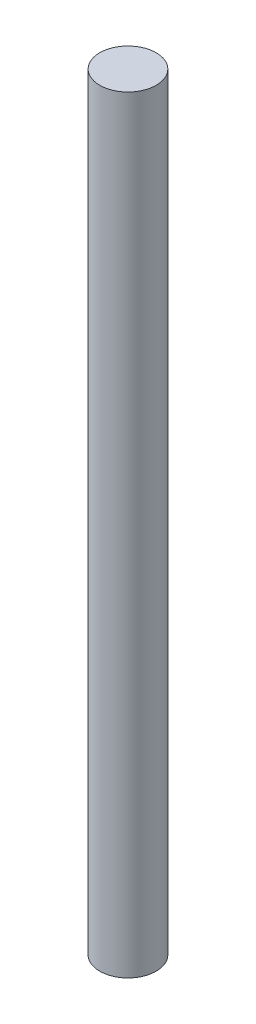
ISO-10303-21;
HEADER;
FILE_DESCRIPTION(('STEP AP214'),'2;1');
FILE_NAME('part.step','',(''),(''),'','','');
FILE_SCHEMA(('AUTOMOTIVE_DESIGN { 1 0 10303 214 1 1 1 1 }'));
ENDSEC;
DATA;
#1=APPLICATION_CONTEXT('core data for automotive mechanical design processes');
#2=APPLICATION_PROTOCOL_DEFINITION('international standard','automotive_design',2000,#1);
#3=PRODUCT_CONTEXT('',#1,'mechanical');
#4=PRODUCT('Part','Part','',(#3));
#5=PRODUCT_RELATED_PRODUCT_CATEGORY('part','',(#4));
#6=PRODUCT_DEFINITION_FORMATION('','',#4);
#7=PRODUCT_DEFINITION_CONTEXT('part definition',#1,'design');
#8=PRODUCT_DEFINITION('design','',#6,#7);
#9=PRODUCT_DEFINITION_SHAPE('','',#8);
#10=(LENGTH_UNIT() NAMED_UNIT(*) SI_UNIT(.MILLI.,.METRE.));
#11=(NAMED_UNIT(*) PLANE_ANGLE_UNIT() SI_UNIT($,.RADIAN.));
#12=(NAMED_UNIT(*) SI_UNIT($,.STERADIAN.) SOLID_ANGLE_UNIT());
#13=UNCERTAINTY_MEASURE_WITH_UNIT(LENGTH_MEASURE(1.E-05),#10,'distance_accuracy_value','');
#14=(GEOMETRIC_REPRESENTATION_CONTEXT(3) GLOBAL_UNCERTAINTY_ASSIGNED_CONTEXT((#13)) GLOBAL_UNIT_ASSIGNED_CONTEXT((#10,
#11,#12)) REPRESENTATION_CONTEXT('',''));
#15=CARTESIAN_POINT('',(0.,0.,0.));
#16=DIRECTION('',(0.,0.,1.));
#17=DIRECTION('',(1.,0.,0.));
#18=AXIS2_PLACEMENT_3D('',#15,#16,#17);
#19=CARTESIAN_POINT('',(7.49999999999998,204.,0.));
#20=DIRECTION('',(0.,-1.,0.));
#21=DIRECTION('',(1.,0.,0.));
#22=AXIS2_PLACEMENT_3D('',#19,#20,#21);
#23=PLANE('',#22);
#24=CARTESIAN_POINT('',(0.,204.,0.));
#25=DIRECTION('',(0.,1.,0.));
#26=DIRECTION('',(-1.,0.,0.));
#27=AXIS2_PLACEMENT_3D('',#24,#25,#26);
#28=CIRCLE('',#27,7.49999999999997);
#29=CARTESIAN_POINT('',(-7.49999999999997,204.,0.));
#30=VERTEX_POINT('',#29);
#31=EDGE_CURVE('E150',#30,#30,#28,.T.);
#32=ORIENTED_EDGE('',*,*,#31,.T.);
#33=EDGE_LOOP('',(#32));
#34=FACE_BOUND('',#33,.T.);
#35=ADVANCED_FACE('F32',(#34),#23,.F.);
#36=CARTESIAN_POINT('',(0.,204.,0.));
#37=DIRECTION('',(0.,1.,0.));
#38=DIRECTION('',(-1.,0.,0.));
#39=AXIS2_PLACEMENT_3D('',#36,#37,#38);
#40=CYLINDRICAL_SURFACE('',#39,7.49999999999998);
#41=DIRECTION('',(0.,1.,0.));
#42=VECTOR('',#41,1.);
#43=CARTESIAN_POINT('',(-1.49999999999999,204.,-7.34846922834952));
#44=LINE('',#43,#42);
#45=CARTESIAN_POINT('',(-1.5,89.,-7.34846922834952));
#46=VERTEX_POINT('',#45);
#47=CARTESIAN_POINT('',(-1.5,104.,-7.34846922834952));
#48=VERTEX_POINT('',#47);
#49=EDGE_CURVE('E39',#46,#48,#44,.T.);
#50=ORIENTED_EDGE('',*,*,#49,.F.);
#51=CARTESIAN_POINT('',(0.,89.,0.));
#52=DIRECTION('',(0.,-1.,0.));
#53=DIRECTION('',(0.,0.,-1.));
#54=AXIS2_PLACEMENT_3D('',#51,#52,#53);
#55=CIRCLE('',#54,7.49999999999998);
#56=CARTESIAN_POINT('',(1.5,89.,-7.34846922834952));
#57=VERTEX_POINT('',#56);
#58=EDGE_CURVE('E11',#46,#57,#55,.T.);
#59=ORIENTED_EDGE('',*,*,#58,.T.);
#60=DIRECTION('',(0.,1.,0.));
#61=VECTOR('',#60,1.);
#62=CARTESIAN_POINT('',(1.50000000000001,204.,-7.34846922834952));
#63=LINE('',#62,#61);
#64=CARTESIAN_POINT('',(1.5,104.,-7.34846922834952));
#65=VERTEX_POINT('',#64);
#66=EDGE_CURVE('E103',#65,#57,#63,.F.);
#67=ORIENTED_EDGE('',*,*,#66,.F.);
#68=CARTESIAN_POINT('',(0.,104.,0.));
#69=DIRECTION('',(0.,-1.,0.));
#70=DIRECTION('',(0.,0.,-1.));
#71=AXIS2_PLACEMENT_3D('',#68,#69,#70);
#72=CIRCLE('',#71,7.49999999999998);
#73=EDGE_CURVE('E164',#48,#65,#72,.T.);
#74=ORIENTED_EDGE('',*,*,#73,.F.);
#75=EDGE_LOOP('',(#50,#59,#67,#74));
#76=FACE_BOUND('',#75,.T.);
#77=DIRECTION('',(0.,1.,0.));
#78=VECTOR('',#77,1.);
#79=CARTESIAN_POINT('',(-1.5,204.,-7.34846922834952));
#80=LINE('',#79,#78);
#81=CARTESIAN_POINT('',(-1.5,187.,-7.34846922834952));
#82=VERTEX_POINT('',#81);
#83=CARTESIAN_POINT('',(-1.49999999999999,169.,-7.34846922834952));
#84=VERTEX_POINT('',#83);
#85=EDGE_CURVE('E158',#82,#84,#80,.F.);
#86=ORIENTED_EDGE('',*,*,#85,.T.);
#87=CARTESIAN_POINT('',(0.,169.,0.));
#88=DIRECTION('',(0.,-1.,0.));
#89=DIRECTION('',(0.,0.,-1.));
#90=AXIS2_PLACEMENT_3D('',#87,#88,#89);
#91=CIRCLE('',#90,7.49999999999998);
#92=CARTESIAN_POINT('',(1.50000000000001,169.,-7.34846922834952));
#93=VERTEX_POINT('',#92);
#94=EDGE_CURVE('E161',#84,#93,#91,.T.);
#95=ORIENTED_EDGE('',*,*,#94,.T.);
#96=DIRECTION('',(0.,1.,0.));
#97=VECTOR('',#96,1.);
#98=CARTESIAN_POINT('',(1.5,204.,-7.34846922834952));
#99=LINE('',#98,#97);
#100=CARTESIAN_POINT('',(1.50000000000001,187.,-7.34846922834952));
#101=VERTEX_POINT('',#100);
#102=EDGE_CURVE('E155',#93,#101,#99,.T.);
#103=ORIENTED_EDGE('',*,*,#102,.T.);
#104=CARTESIAN_POINT('',(0.,187.,0.));
#105=DIRECTION('',(0.,-1.,0.));
#106=DIRECTION('',(0.,0.,-1.));
#107=AXIS2_PLACEMENT_3D('',#104,#105,#106);
#108=CIRCLE('',#107,7.49999999999998);
#109=EDGE_CURVE('E153',#82,#101,#108,.T.);
#110=ORIENTED_EDGE('',*,*,#109,.F.);
#111=EDGE_LOOP('',(#86,#95,#103,#110));
#112=FACE_BOUND('',#111,.T.);
#113=ORIENTED_EDGE('',*,*,#31,.F.);
#114=EDGE_LOOP('',(#113));
#115=FACE_BOUND('',#114,.T.);
#116=CARTESIAN_POINT('',(0.,0.,0.));
#117=DIRECTION('',(0.,1.,0.));
#118=DIRECTION('',(-1.,0.,0.));
#119=AXIS2_PLACEMENT_3D('',#116,#117,#118);
#120=CIRCLE('',#119,7.5);
#121=CARTESIAN_POINT('',(-7.5,0.,0.));
#122=VERTEX_POINT('',#121);
#123=EDGE_CURVE('E145',#122,#122,#120,.T.);
#124=ORIENTED_EDGE('',*,*,#123,.T.);
#125=EDGE_LOOP('',(#124));
#126=FACE_BOUND('',#125,.T.);
#127=ADVANCED_FACE('F171',(#76,#112,#115,#126),#40,.T.);
#128=CARTESIAN_POINT('',(7.5,0.,0.));
#129=DIRECTION('',(0.,1.,0.));
#130=DIRECTION('',(-1.,0.,0.));
#131=AXIS2_PLACEMENT_3D('',#128,#129,#130);
#132=PLANE('',#131);
#133=ORIENTED_EDGE('',*,*,#123,.F.);
#134=EDGE_LOOP('',(#133));
#135=FACE_BOUND('',#134,.T.);
#136=ADVANCED_FACE('F187',(#135),#132,.F.);
#137=CARTESIAN_POINT('',(-1.49999999999999,169.,-8.99999999999997));
#138=DIRECTION('',(-1.,0.,0.));
#139=DIRECTION('',(0.,0.,1.));
#140=AXIS2_PLACEMENT_3D('',#137,#138,#139);
#141=PLANE('',#140);
#142=DIRECTION('',(0.,0.,1.));
#143=VECTOR('',#142,1.);
#144=CARTESIAN_POINT('',(-1.5,187.,-8.99999999999997));
#145=LINE('',#144,#143);
#146=CARTESIAN_POINT('',(-1.5,187.,-5.99999999999997));
#147=VERTEX_POINT('',#146);
#148=EDGE_CURVE('E54',#82,#147,#145,.T.);
#149=ORIENTED_EDGE('',*,*,#148,.T.);
#150=DIRECTION('',(0.,1.,0.));
#151=VECTOR('',#150,1.);
#152=CARTESIAN_POINT('',(-1.49999999999999,169.,-5.99999999999997));
#153=LINE('',#152,#151);
#154=CARTESIAN_POINT('',(-1.49999999999999,169.,-5.99999999999997));
#155=VERTEX_POINT('',#154);
#156=EDGE_CURVE('E136',#155,#147,#153,.T.);
#157=ORIENTED_EDGE('',*,*,#156,.F.);
#158=DIRECTION('',(0.,0.,1.));
#159=VECTOR('',#158,1.);
#160=CARTESIAN_POINT('',(-1.49999999999999,169.,-8.99999999999997));
#161=LINE('',#160,#159);
#162=EDGE_CURVE('E127',#84,#155,#161,.T.);
#163=ORIENTED_EDGE('',*,*,#162,.F.);
#164=ORIENTED_EDGE('',*,*,#85,.F.);
#165=EDGE_LOOP('',(#149,#157,#163,#164));
#166=FACE_BOUND('',#165,.T.);
#167=ADVANCED_FACE('F194',(#166),#141,.F.);
#168=CARTESIAN_POINT('',(1.50000000000001,169.,-8.99999999999997));
#169=DIRECTION('',(1.,0.,0.));
#170=DIRECTION('',(0.,1.,0.));
#171=AXIS2_PLACEMENT_3D('',#168,#169,#170);
#172=PLANE('',#171);
#173=DIRECTION('',(0.,0.,-1.));
#174=VECTOR('',#173,1.);
#175=CARTESIAN_POINT('',(1.50000000000001,169.,-8.99999999999997));
#176=LINE('',#175,#174);
#177=CARTESIAN_POINT('',(1.50000000000001,169.,-5.99999999999997));
#178=VERTEX_POINT('',#177);
#179=EDGE_CURVE('E133',#178,#93,#176,.T.);
#180=ORIENTED_EDGE('',*,*,#179,.F.);
#181=DIRECTION('',(0.,1.,0.));
#182=VECTOR('',#181,1.);
#183=CARTESIAN_POINT('',(1.50000000000001,169.,-5.99999999999997));
#184=LINE('',#183,#182);
#185=CARTESIAN_POINT('',(1.50000000000001,187.,-5.99999999999997));
#186=VERTEX_POINT('',#185);
#187=EDGE_CURVE('E143',#178,#186,#184,.T.);
#188=ORIENTED_EDGE('',*,*,#187,.T.);
#189=DIRECTION('',(0.,0.,-1.));
#190=VECTOR('',#189,1.);
#191=CARTESIAN_POINT('',(1.50000000000001,187.,-8.99999999999997));
#192=LINE('',#191,#190);
#193=EDGE_CURVE('E130',#186,#101,#192,.T.);
#194=ORIENTED_EDGE('',*,*,#193,.T.);
#195=ORIENTED_EDGE('',*,*,#102,.F.);
#196=EDGE_LOOP('',(#180,#188,#194,#195));
#197=FACE_BOUND('',#196,.T.);
#198=ADVANCED_FACE('F199',(#197),#172,.F.);
#199=CARTESIAN_POINT('',(0.,169.,0.));
#200=DIRECTION('',(0.,-1.,0.));
#201=DIRECTION('',(0.,0.,-1.));
#202=AXIS2_PLACEMENT_3D('',#199,#200,#201);
#203=PLANE('',#202);
#204=ORIENTED_EDGE('',*,*,#162,.T.);
#205=DIRECTION('',(1.,0.,0.));
#206=VECTOR('',#205,1.);
#207=CARTESIAN_POINT('',(1.50000000000001,169.,-5.99999999999997));
#208=LINE('',#207,#206);
#209=EDGE_CURVE('E129',#155,#178,#208,.T.);
#210=ORIENTED_EDGE('',*,*,#209,.T.);
#211=ORIENTED_EDGE('',*,*,#179,.T.);
#212=ORIENTED_EDGE('',*,*,#94,.F.);
#213=EDGE_LOOP('',(#204,#210,#211,#212));
#214=FACE_BOUND('',#213,.T.);
#215=ADVANCED_FACE('F210',(#214),#203,.F.);
#216=CARTESIAN_POINT('',(0.,187.,0.));
#217=DIRECTION('',(0.,-1.,0.));
#218=DIRECTION('',(0.,0.,-1.));
#219=AXIS2_PLACEMENT_3D('',#216,#217,#218);
#220=PLANE('',#219);
#221=ORIENTED_EDGE('',*,*,#109,.T.);
#222=ORIENTED_EDGE('',*,*,#193,.F.);
#223=DIRECTION('',(1.,0.,0.));
#224=VECTOR('',#223,1.);
#225=CARTESIAN_POINT('',(1.50000000000001,187.,-5.99999999999997));
#226=LINE('',#225,#224);
#227=EDGE_CURVE('E138',#147,#186,#226,.T.);
#228=ORIENTED_EDGE('',*,*,#227,.F.);
#229=ORIENTED_EDGE('',*,*,#148,.F.);
#230=EDGE_LOOP('',(#221,#222,#228,#229));
#231=FACE_BOUND('',#230,.T.);
#232=ADVANCED_FACE('F206',(#231),#220,.T.);
#233=CARTESIAN_POINT('',(1.50000000000001,169.,-5.99999999999997));
#234=DIRECTION('',(0.,0.,1.));
#235=DIRECTION('',(1.,0.,0.));
#236=AXIS2_PLACEMENT_3D('',#233,#234,#235);
#237=PLANE('',#236);
#238=ORIENTED_EDGE('',*,*,#227,.T.);
#239=ORIENTED_EDGE('',*,*,#187,.F.);
#240=ORIENTED_EDGE('',*,*,#209,.F.);
#241=ORIENTED_EDGE('',*,*,#156,.T.);
#242=EDGE_LOOP('',(#238,#239,#240,#241));
#243=FACE_BOUND('',#242,.T.);
#244=ADVANCED_FACE('F203',(#243),#237,.F.);
#245=CARTESIAN_POINT('',(-1.5,89.,-9.));
#246=DIRECTION('',(1.,0.,0.));
#247=DIRECTION('',(0.,0.,-1.));
#248=AXIS2_PLACEMENT_3D('',#245,#246,#247);
#249=PLANE('',#248);
#250=ORIENTED_EDGE('',*,*,#49,.T.);
#251=DIRECTION('',(0.,0.,-1.));
#252=VECTOR('',#251,1.);
#253=CARTESIAN_POINT('',(-1.5,104.,-9.));
#254=LINE('',#253,#252);
#255=CARTESIAN_POINT('',(-1.5,104.,-6.));
#256=VERTEX_POINT('',#255);
#257=EDGE_CURVE('E46',#256,#48,#254,.T.);
#258=ORIENTED_EDGE('',*,*,#257,.F.);
#259=DIRECTION('',(0.,1.,0.));
#260=VECTOR('',#259,1.);
#261=CARTESIAN_POINT('',(-1.5,89.,-6.));
#262=LINE('',#261,#260);
#263=CARTESIAN_POINT('',(-1.5,89.,-6.));
#264=VERTEX_POINT('',#263);
#265=EDGE_CURVE('E114',#264,#256,#262,.T.);
#266=ORIENTED_EDGE('',*,*,#265,.F.);
#267=DIRECTION('',(0.,0.,-1.));
#268=VECTOR('',#267,1.);
#269=CARTESIAN_POINT('',(-1.5,89.,-9.));
#270=LINE('',#269,#268);
#271=EDGE_CURVE('E107',#264,#46,#270,.T.);
#272=ORIENTED_EDGE('',*,*,#271,.T.);
#273=EDGE_LOOP('',(#250,#258,#266,#272));
#274=FACE_BOUND('',#273,.T.);
#275=ADVANCED_FACE('F169',(#274),#249,.T.);
#276=CARTESIAN_POINT('',(1.5,89.,-9.));
#277=DIRECTION('',(-1.,0.,0.));
#278=DIRECTION('',(0.,0.,1.));
#279=AXIS2_PLACEMENT_3D('',#276,#277,#278);
#280=PLANE('',#279);
#281=ORIENTED_EDGE('',*,*,#66,.T.);
#282=DIRECTION('',(0.,0.,1.));
#283=VECTOR('',#282,1.);
#284=CARTESIAN_POINT('',(1.5,89.,-9.));
#285=LINE('',#284,#283);
#286=CARTESIAN_POINT('',(1.5,89.,-6.));
#287=VERTEX_POINT('',#286);
#288=EDGE_CURVE('E96',#57,#287,#285,.T.);
#289=ORIENTED_EDGE('',*,*,#288,.T.);
#290=DIRECTION('',(0.,1.,0.));
#291=VECTOR('',#290,1.);
#292=CARTESIAN_POINT('',(1.5,89.,-6.));
#293=LINE('',#292,#291);
#294=CARTESIAN_POINT('',(1.5,104.,-6.));
#295=VERTEX_POINT('',#294);
#296=EDGE_CURVE('E100',#287,#295,#293,.T.);
#297=ORIENTED_EDGE('',*,*,#296,.T.);
#298=DIRECTION('',(0.,0.,1.));
#299=VECTOR('',#298,1.);
#300=CARTESIAN_POINT('',(1.5,104.,-9.));
#301=LINE('',#300,#299);
#302=EDGE_CURVE('E124',#65,#295,#301,.T.);
#303=ORIENTED_EDGE('',*,*,#302,.F.);
#304=EDGE_LOOP('',(#281,#289,#297,#303));
#305=FACE_BOUND('',#304,.T.);
#306=ADVANCED_FACE('F98',(#305),#280,.T.);
#307=CARTESIAN_POINT('',(0.,89.,0.));
#308=DIRECTION('',(0.,-1.,0.));
#309=DIRECTION('',(0.,0.,-1.));
#310=AXIS2_PLACEMENT_3D('',#307,#308,#309);
#311=PLANE('',#310);
#312=ORIENTED_EDGE('',*,*,#271,.F.);
#313=DIRECTION('',(-1.,0.,0.));
#314=VECTOR('',#313,1.);
#315=CARTESIAN_POINT('',(1.5,89.,-6.));
#316=LINE('',#315,#314);
#317=EDGE_CURVE('E106',#287,#264,#316,.T.);
#318=ORIENTED_EDGE('',*,*,#317,.F.);
#319=ORIENTED_EDGE('',*,*,#288,.F.);
#320=ORIENTED_EDGE('',*,*,#58,.F.);
#321=EDGE_LOOP('',(#312,#318,#319,#320));
#322=FACE_BOUND('',#321,.T.);
#323=ADVANCED_FACE('F117',(#322),#311,.F.);
#324=CARTESIAN_POINT('',(0.,104.,0.));
#325=DIRECTION('',(0.,-1.,0.));
#326=DIRECTION('',(0.,0.,-1.));
#327=AXIS2_PLACEMENT_3D('',#324,#325,#326);
#328=PLANE('',#327);
#329=ORIENTED_EDGE('',*,*,#73,.T.);
#330=ORIENTED_EDGE('',*,*,#302,.T.);
#331=DIRECTION('',(-1.,0.,0.));
#332=VECTOR('',#331,1.);
#333=CARTESIAN_POINT('',(1.5,104.,-6.));
#334=LINE('',#333,#332);
#335=EDGE_CURVE('E113',#295,#256,#334,.T.);
#336=ORIENTED_EDGE('',*,*,#335,.T.);
#337=ORIENTED_EDGE('',*,*,#257,.T.);
#338=EDGE_LOOP('',(#329,#330,#336,#337));
#339=FACE_BOUND('',#338,.T.);
#340=ADVANCED_FACE('F173',(#339),#328,.T.);
#341=CARTESIAN_POINT('',(1.5,89.,-6.));
#342=DIRECTION('',(0.,0.,-1.));
#343=DIRECTION('',(-1.,0.,0.));
#344=AXIS2_PLACEMENT_3D('',#341,#342,#343);
#345=PLANE('',#344);
#346=ORIENTED_EDGE('',*,*,#335,.F.);
#347=ORIENTED_EDGE('',*,*,#296,.F.);
#348=ORIENTED_EDGE('',*,*,#317,.T.);
#349=ORIENTED_EDGE('',*,*,#265,.T.);
#350=EDGE_LOOP('',(#346,#347,#348,#349));
#351=FACE_BOUND('',#350,.T.);
#352=ADVANCED_FACE('F110',(#351),#345,.T.);
#353=CLOSED_SHELL('',(#35,#127,#136,#167,#198,#215,#232,#244,#275,#306,#323,#340,#352));
#354=MANIFOLD_SOLID_BREP('B2',#353);
#355=ADVANCED_BREP_SHAPE_REPRESENTATION('',(#18,#354),#14);
#356=SHAPE_DEFINITION_REPRESENTATION(#9,#355);
ENDSEC;
END-ISO-10303-21;
